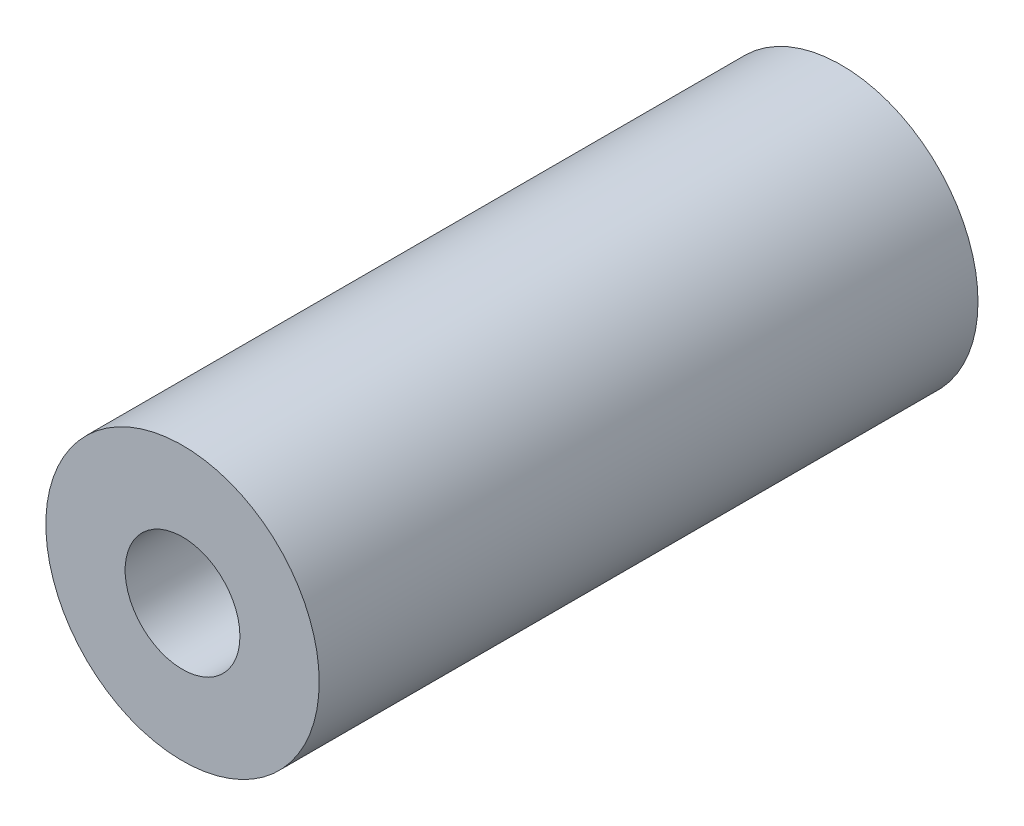
ISO-10303-21;
HEADER;
FILE_DESCRIPTION(('STEP AP214'),'2;1');
FILE_NAME('part.step','',(''),(''),'','','');
FILE_SCHEMA(('AUTOMOTIVE_DESIGN { 1 0 10303 214 1 1 1 1 }'));
ENDSEC;
DATA;
#1=APPLICATION_CONTEXT('core data for automotive mechanical design processes');
#2=APPLICATION_PROTOCOL_DEFINITION('international standard','automotive_design',2000,#1);
#3=PRODUCT_CONTEXT('',#1,'mechanical');
#4=PRODUCT('Part','Part','',(#3));
#5=PRODUCT_RELATED_PRODUCT_CATEGORY('part','',(#4));
#6=PRODUCT_DEFINITION_FORMATION('','',#4);
#7=PRODUCT_DEFINITION_CONTEXT('part definition',#1,'design');
#8=PRODUCT_DEFINITION('design','',#6,#7);
#9=PRODUCT_DEFINITION_SHAPE('','',#8);
#10=(LENGTH_UNIT() NAMED_UNIT(*) SI_UNIT(.MILLI.,.METRE.));
#11=(NAMED_UNIT(*) PLANE_ANGLE_UNIT() SI_UNIT($,.RADIAN.));
#12=(NAMED_UNIT(*) SI_UNIT($,.STERADIAN.) SOLID_ANGLE_UNIT());
#13=UNCERTAINTY_MEASURE_WITH_UNIT(LENGTH_MEASURE(1.E-05),#10,'distance_accuracy_value','');
#14=(GEOMETRIC_REPRESENTATION_CONTEXT(3) GLOBAL_UNCERTAINTY_ASSIGNED_CONTEXT((#13)) GLOBAL_UNIT_ASSIGNED_CONTEXT((#10,
#11,#12)) REPRESENTATION_CONTEXT('',''));
#15=CARTESIAN_POINT('',(0.,0.,0.));
#16=DIRECTION('',(0.,0.,1.));
#17=DIRECTION('',(1.,0.,0.));
#18=AXIS2_PLACEMENT_3D('',#15,#16,#17);
#19=CARTESIAN_POINT('',(0.,0.,24.1));
#20=DIRECTION('',(0.,0.,-1.));
#21=DIRECTION('',(-1.,0.,0.));
#22=AXIS2_PLACEMENT_3D('',#19,#20,#21);
#23=CYLINDRICAL_SURFACE('',#22,5.);
#24=CARTESIAN_POINT('',(0.,0.,24.1));
#25=DIRECTION('',(0.,0.,1.));
#26=DIRECTION('',(1.,0.,0.));
#27=AXIS2_PLACEMENT_3D('',#24,#25,#26);
#28=CIRCLE('',#27,5.);
#29=CARTESIAN_POINT('',(5.,0.,24.1));
#30=VERTEX_POINT('',#29);
#31=EDGE_CURVE('E10',#30,#30,#28,.T.);
#32=ORIENTED_EDGE('',*,*,#31,.F.);
#33=EDGE_LOOP('',(#32));
#34=FACE_BOUND('',#33,.T.);
#35=CARTESIAN_POINT('',(0.,0.,0.));
#36=DIRECTION('',(0.,0.,1.));
#37=DIRECTION('',(1.,0.,0.));
#38=AXIS2_PLACEMENT_3D('',#35,#36,#37);
#39=CIRCLE('',#38,5.);
#40=CARTESIAN_POINT('',(5.,0.,0.));
#41=VERTEX_POINT('',#40);
#42=EDGE_CURVE('E36',#41,#41,#39,.T.);
#43=ORIENTED_EDGE('',*,*,#42,.T.);
#44=EDGE_LOOP('',(#43));
#45=FACE_BOUND('',#44,.T.);
#46=ADVANCED_FACE('F33',(#34,#45),#23,.T.);
#47=CARTESIAN_POINT('',(0.,0.,24.1));
#48=DIRECTION('',(0.,0.,1.));
#49=DIRECTION('',(1.,0.,0.));
#50=AXIS2_PLACEMENT_3D('',#47,#48,#49);
#51=PLANE('',#50);
#52=CARTESIAN_POINT('',(0.,0.,24.1));
#53=DIRECTION('',(0.,0.,1.));
#54=DIRECTION('',(1.,0.,0.));
#55=AXIS2_PLACEMENT_3D('',#52,#53,#54);
#56=CIRCLE('',#55,2.1);
#57=CARTESIAN_POINT('',(2.1,0.,24.1));
#58=VERTEX_POINT('',#57);
#59=EDGE_CURVE('E43',#58,#58,#56,.T.);
#60=ORIENTED_EDGE('',*,*,#59,.F.);
#61=EDGE_LOOP('',(#60));
#62=FACE_BOUND('',#61,.T.);
#63=ORIENTED_EDGE('',*,*,#31,.T.);
#64=EDGE_LOOP('',(#63));
#65=FACE_BOUND('',#64,.T.);
#66=ADVANCED_FACE('F61',(#62,#65),#51,.T.);
#67=CARTESIAN_POINT('',(0.,0.,0.));
#68=DIRECTION('',(0.,0.,1.));
#69=DIRECTION('',(1.,0.,0.));
#70=AXIS2_PLACEMENT_3D('',#67,#68,#69);
#71=PLANE('',#70);
#72=CARTESIAN_POINT('',(0.,0.,0.));
#73=DIRECTION('',(0.,0.,1.));
#74=DIRECTION('',(1.,0.,0.));
#75=AXIS2_PLACEMENT_3D('',#72,#73,#74);
#76=CIRCLE('',#75,2.1);
#77=CARTESIAN_POINT('',(2.1,0.,0.));
#78=VERTEX_POINT('',#77);
#79=EDGE_CURVE('E47',#78,#78,#76,.T.);
#80=ORIENTED_EDGE('',*,*,#79,.T.);
#81=EDGE_LOOP('',(#80));
#82=FACE_BOUND('',#81,.T.);
#83=ORIENTED_EDGE('',*,*,#42,.F.);
#84=EDGE_LOOP('',(#83));
#85=FACE_BOUND('',#84,.T.);
#86=ADVANCED_FACE('F51',(#82,#85),#71,.F.);
#87=CARTESIAN_POINT('',(0.,0.,0.));
#88=DIRECTION('',(0.,0.,1.));
#89=DIRECTION('',(1.,0.,0.));
#90=AXIS2_PLACEMENT_3D('',#87,#88,#89);
#91=CYLINDRICAL_SURFACE('',#90,2.1);
#92=ORIENTED_EDGE('',*,*,#59,.T.);
#93=EDGE_LOOP('',(#92));
#94=FACE_BOUND('',#93,.T.);
#95=ORIENTED_EDGE('',*,*,#79,.F.);
#96=EDGE_LOOP('',(#95));
#97=FACE_BOUND('',#96,.T.);
#98=ADVANCED_FACE('F54',(#94,#97),#91,.F.);
#99=CLOSED_SHELL('',(#46,#66,#86,#98));
#100=MANIFOLD_SOLID_BREP('B2',#99);
#101=ADVANCED_BREP_SHAPE_REPRESENTATION('',(#18,#100),#14);
#102=SHAPE_DEFINITION_REPRESENTATION(#9,#101);
ENDSEC;
END-ISO-10303-21;
